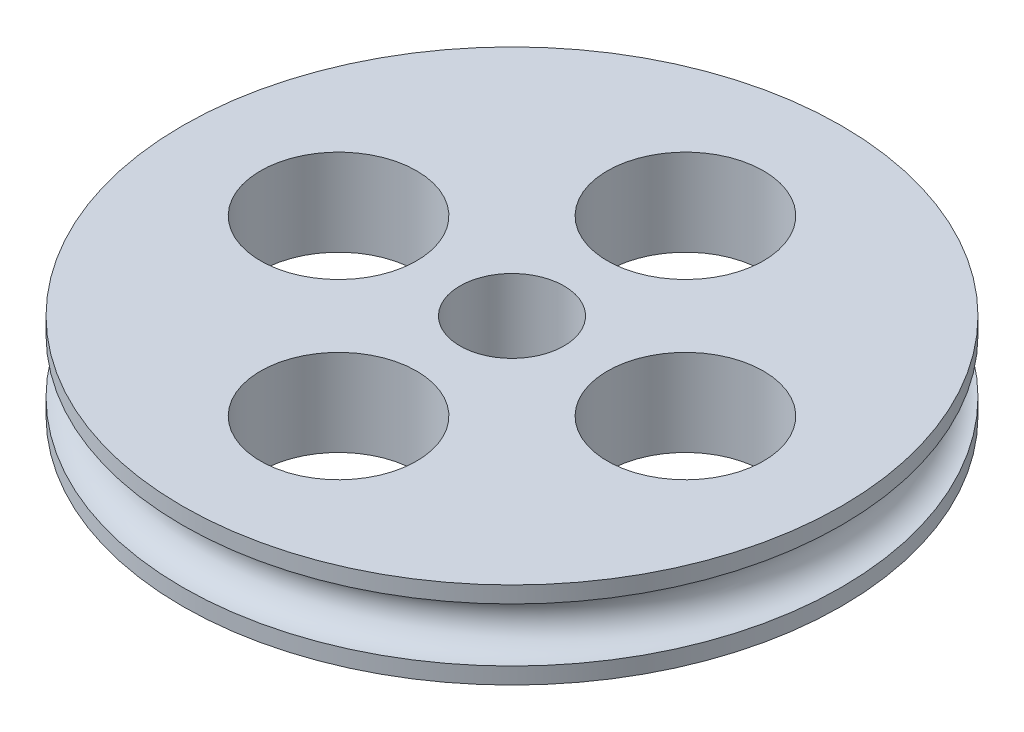
ISO-10303-21;
HEADER;
FILE_DESCRIPTION(('STEP AP214'),'2;1');
FILE_NAME('part.step','',(''),(''),'','','');
FILE_SCHEMA(('AUTOMOTIVE_DESIGN { 1 0 10303 214 1 1 1 1 }'));
ENDSEC;
DATA;
#1=APPLICATION_CONTEXT('core data for automotive mechanical design processes');
#2=APPLICATION_PROTOCOL_DEFINITION('international standard','automotive_design',2000,#1);
#3=PRODUCT_CONTEXT('',#1,'mechanical');
#4=PRODUCT('Part','Part','',(#3));
#5=PRODUCT_RELATED_PRODUCT_CATEGORY('part','',(#4));
#6=PRODUCT_DEFINITION_FORMATION('','',#4);
#7=PRODUCT_DEFINITION_CONTEXT('part definition',#1,'design');
#8=PRODUCT_DEFINITION('design','',#6,#7);
#9=PRODUCT_DEFINITION_SHAPE('','',#8);
#10=(LENGTH_UNIT() NAMED_UNIT(*) SI_UNIT(.MILLI.,.METRE.));
#11=(NAMED_UNIT(*) PLANE_ANGLE_UNIT() SI_UNIT($,.RADIAN.));
#12=(NAMED_UNIT(*) SI_UNIT($,.STERADIAN.) SOLID_ANGLE_UNIT());
#13=UNCERTAINTY_MEASURE_WITH_UNIT(LENGTH_MEASURE(1.E-05),#10,'distance_accuracy_value','');
#14=(GEOMETRIC_REPRESENTATION_CONTEXT(3) GLOBAL_UNCERTAINTY_ASSIGNED_CONTEXT((#13)) GLOBAL_UNIT_ASSIGNED_CONTEXT((#10,
#11,#12)) REPRESENTATION_CONTEXT('',''));
#15=CARTESIAN_POINT('',(0.,0.,0.));
#16=DIRECTION('',(0.,0.,1.));
#17=DIRECTION('',(1.,0.,0.));
#18=AXIS2_PLACEMENT_3D('',#15,#16,#17);
#19=CARTESIAN_POINT('',(0.,2.5,0.));
#20=DIRECTION('',(0.,-1.,0.));
#21=DIRECTION('',(0.,0.,-1.));
#22=AXIS2_PLACEMENT_3D('',#19,#20,#21);
#23=TOROIDAL_SURFACE('',#22,19.,1.55);
#24=CARTESIAN_POINT('',(0.,0.95,0.));
#25=DIRECTION('',(0.,-1.,0.));
#26=DIRECTION('',(0.,0.,-1.));
#27=AXIS2_PLACEMENT_3D('',#24,#25,#26);
#28=CIRCLE('',#27,19.);
#29=CARTESIAN_POINT('',(0.,0.95,-19.));
#30=VERTEX_POINT('',#29);
#31=EDGE_CURVE('E10',#30,#30,#28,.T.);
#32=ORIENTED_EDGE('',*,*,#31,.F.);
#33=EDGE_LOOP('',(#32));
#34=FACE_BOUND('',#33,.T.);
#35=CARTESIAN_POINT('',(0.,4.05,0.));
#36=DIRECTION('',(0.,-1.,0.));
#37=DIRECTION('',(0.,0.,-1.));
#38=AXIS2_PLACEMENT_3D('',#35,#36,#37);
#39=CIRCLE('',#38,19.);
#40=CARTESIAN_POINT('',(0.,4.05,-19.));
#41=VERTEX_POINT('',#40);
#42=EDGE_CURVE('E55',#41,#41,#39,.T.);
#43=ORIENTED_EDGE('',*,*,#42,.T.);
#44=EDGE_LOOP('',(#43));
#45=FACE_BOUND('',#44,.T.);
#46=ADVANCED_FACE('F33',(#34,#45),#23,.F.);
#47=CARTESIAN_POINT('',(0.,0.,0.));
#48=DIRECTION('',(0.,-1.,0.));
#49=DIRECTION('',(0.,0.,-1.));
#50=AXIS2_PLACEMENT_3D('',#47,#48,#49);
#51=CYLINDRICAL_SURFACE('',#50,19.);
#52=CARTESIAN_POINT('',(0.,0.,0.));
#53=DIRECTION('',(0.,-1.,0.));
#54=DIRECTION('',(0.,0.,-1.));
#55=AXIS2_PLACEMENT_3D('',#52,#53,#54);
#56=CIRCLE('',#55,19.);
#57=CARTESIAN_POINT('',(0.,0.,-19.));
#58=VERTEX_POINT('',#57);
#59=EDGE_CURVE('E39',#58,#58,#56,.T.);
#60=ORIENTED_EDGE('',*,*,#59,.F.);
#61=EDGE_LOOP('',(#60));
#62=FACE_BOUND('',#61,.T.);
#63=ORIENTED_EDGE('',*,*,#31,.T.);
#64=EDGE_LOOP('',(#63));
#65=FACE_BOUND('',#64,.T.);
#66=ADVANCED_FACE('F97',(#62,#65),#51,.T.);
#67=CARTESIAN_POINT('',(-19.,0.,0.));
#68=DIRECTION('',(0.,1.,0.));
#69=DIRECTION('',(0.,0.,1.));
#70=AXIS2_PLACEMENT_3D('',#67,#68,#69);
#71=PLANE('',#70);
#72=CARTESIAN_POINT('',(-10.,0.,1.04744440165294E-13));
#73=DIRECTION('',(0.,-1.,0.));
#74=DIRECTION('',(0.,0.,-1.));
#75=AXIS2_PLACEMENT_3D('',#72,#73,#74);
#76=CIRCLE('',#75,4.5);
#77=CARTESIAN_POINT('',(-10.,0.,-4.49999999999989));
#78=VERTEX_POINT('',#77);
#79=EDGE_CURVE('E77',#78,#78,#76,.T.);
#80=ORIENTED_EDGE('',*,*,#79,.F.);
#81=EDGE_LOOP('',(#80));
#82=FACE_BOUND('',#81,.T.);
#83=CARTESIAN_POINT('',(0.,0.,-10.));
#84=DIRECTION('',(0.,-1.,0.));
#85=DIRECTION('',(0.,0.,-1.));
#86=AXIS2_PLACEMENT_3D('',#83,#84,#85);
#87=CIRCLE('',#86,4.5);
#88=CARTESIAN_POINT('',(0.,0.,-14.5));
#89=VERTEX_POINT('',#88);
#90=EDGE_CURVE('E71',#89,#89,#87,.T.);
#91=ORIENTED_EDGE('',*,*,#90,.F.);
#92=EDGE_LOOP('',(#91));
#93=FACE_BOUND('',#92,.T.);
#94=CARTESIAN_POINT('',(10.,0.,0.));
#95=DIRECTION('',(0.,-1.,0.));
#96=DIRECTION('',(0.,0.,-1.));
#97=AXIS2_PLACEMENT_3D('',#94,#95,#96);
#98=CIRCLE('',#97,4.5);
#99=CARTESIAN_POINT('',(10.,0.,-4.50000000000003));
#100=VERTEX_POINT('',#99);
#101=EDGE_CURVE('E65',#100,#100,#98,.T.);
#102=ORIENTED_EDGE('',*,*,#101,.F.);
#103=EDGE_LOOP('',(#102));
#104=FACE_BOUND('',#103,.T.);
#105=CARTESIAN_POINT('',(0.,0.,10.));
#106=DIRECTION('',(0.,-1.,0.));
#107=DIRECTION('',(0.,0.,-1.));
#108=AXIS2_PLACEMENT_3D('',#105,#106,#107);
#109=CIRCLE('',#108,4.5);
#110=CARTESIAN_POINT('',(0.,0.,5.5));
#111=VERTEX_POINT('',#110);
#112=EDGE_CURVE('E59',#111,#111,#109,.T.);
#113=ORIENTED_EDGE('',*,*,#112,.F.);
#114=EDGE_LOOP('',(#113));
#115=FACE_BOUND('',#114,.T.);
#116=CARTESIAN_POINT('',(0.,0.,0.));
#117=DIRECTION('',(0.,-1.,0.));
#118=DIRECTION('',(0.,0.,-1.));
#119=AXIS2_PLACEMENT_3D('',#116,#117,#118);
#120=CIRCLE('',#119,3.);
#121=CARTESIAN_POINT('',(0.,0.,-3.));
#122=VERTEX_POINT('',#121);
#123=EDGE_CURVE('E43',#122,#122,#120,.T.);
#124=ORIENTED_EDGE('',*,*,#123,.F.);
#125=EDGE_LOOP('',(#124));
#126=FACE_BOUND('',#125,.T.);
#127=ORIENTED_EDGE('',*,*,#59,.T.);
#128=EDGE_LOOP('',(#127));
#129=FACE_BOUND('',#128,.T.);
#130=ADVANCED_FACE('F93',(#82,#93,#104,#115,#126,#129),#71,.F.);
#131=CARTESIAN_POINT('',(0.,0.,0.));
#132=DIRECTION('',(0.,-1.,0.));
#133=DIRECTION('',(0.,0.,-1.));
#134=AXIS2_PLACEMENT_3D('',#131,#132,#133);
#135=CYLINDRICAL_SURFACE('',#134,3.);
#136=CARTESIAN_POINT('',(0.,5.,0.));
#137=DIRECTION('',(0.,-1.,0.));
#138=DIRECTION('',(0.,0.,-1.));
#139=AXIS2_PLACEMENT_3D('',#136,#137,#138);
#140=CIRCLE('',#139,3.);
#141=CARTESIAN_POINT('',(0.,5.,-3.));
#142=VERTEX_POINT('',#141);
#143=EDGE_CURVE('E47',#142,#142,#140,.T.);
#144=ORIENTED_EDGE('',*,*,#143,.F.);
#145=EDGE_LOOP('',(#144));
#146=FACE_BOUND('',#145,.T.);
#147=ORIENTED_EDGE('',*,*,#123,.T.);
#148=EDGE_LOOP('',(#147));
#149=FACE_BOUND('',#148,.T.);
#150=ADVANCED_FACE('F96',(#146,#149),#135,.F.);
#151=CARTESIAN_POINT('',(-19.,5.,0.));
#152=DIRECTION('',(0.,-1.,0.));
#153=DIRECTION('',(0.,0.,-1.));
#154=AXIS2_PLACEMENT_3D('',#151,#152,#153);
#155=PLANE('',#154);
#156=CARTESIAN_POINT('',(-10.,5.,1.04744440165294E-13));
#157=DIRECTION('',(0.,-1.,0.));
#158=DIRECTION('',(0.,0.,-1.));
#159=AXIS2_PLACEMENT_3D('',#156,#157,#158);
#160=CIRCLE('',#159,4.5);
#161=CARTESIAN_POINT('',(-10.,5.,-4.49999999999989));
#162=VERTEX_POINT('',#161);
#163=EDGE_CURVE('E74',#162,#162,#160,.T.);
#164=ORIENTED_EDGE('',*,*,#163,.T.);
#165=EDGE_LOOP('',(#164));
#166=FACE_BOUND('',#165,.T.);
#167=CARTESIAN_POINT('',(0.,5.,-10.));
#168=DIRECTION('',(0.,-1.,0.));
#169=DIRECTION('',(0.,0.,-1.));
#170=AXIS2_PLACEMENT_3D('',#167,#168,#169);
#171=CIRCLE('',#170,4.5);
#172=CARTESIAN_POINT('',(0.,5.,-14.5));
#173=VERTEX_POINT('',#172);
#174=EDGE_CURVE('E68',#173,#173,#171,.T.);
#175=ORIENTED_EDGE('',*,*,#174,.T.);
#176=EDGE_LOOP('',(#175));
#177=FACE_BOUND('',#176,.T.);
#178=CARTESIAN_POINT('',(10.,5.,0.));
#179=DIRECTION('',(0.,-1.,0.));
#180=DIRECTION('',(0.,0.,-1.));
#181=AXIS2_PLACEMENT_3D('',#178,#179,#180);
#182=CIRCLE('',#181,4.5);
#183=CARTESIAN_POINT('',(10.,5.,-4.50000000000003));
#184=VERTEX_POINT('',#183);
#185=EDGE_CURVE('E62',#184,#184,#182,.T.);
#186=ORIENTED_EDGE('',*,*,#185,.T.);
#187=EDGE_LOOP('',(#186));
#188=FACE_BOUND('',#187,.T.);
#189=CARTESIAN_POINT('',(0.,5.,10.));
#190=DIRECTION('',(0.,-1.,0.));
#191=DIRECTION('',(0.,0.,-1.));
#192=AXIS2_PLACEMENT_3D('',#189,#190,#191);
#193=CIRCLE('',#192,4.5);
#194=CARTESIAN_POINT('',(0.,5.,5.5));
#195=VERTEX_POINT('',#194);
#196=EDGE_CURVE('E58',#195,#195,#193,.T.);
#197=ORIENTED_EDGE('',*,*,#196,.T.);
#198=EDGE_LOOP('',(#197));
#199=FACE_BOUND('',#198,.T.);
#200=CARTESIAN_POINT('',(0.,5.,0.));
#201=DIRECTION('',(0.,-1.,0.));
#202=DIRECTION('',(0.,0.,-1.));
#203=AXIS2_PLACEMENT_3D('',#200,#201,#202);
#204=CIRCLE('',#203,19.);
#205=CARTESIAN_POINT('',(0.,5.,-19.));
#206=VERTEX_POINT('',#205);
#207=EDGE_CURVE('E52',#206,#206,#204,.T.);
#208=ORIENTED_EDGE('',*,*,#207,.F.);
#209=EDGE_LOOP('',(#208));
#210=FACE_BOUND('',#209,.T.);
#211=ORIENTED_EDGE('',*,*,#143,.T.);
#212=EDGE_LOOP('',(#211));
#213=FACE_BOUND('',#212,.T.);
#214=ADVANCED_FACE('F83',(#166,#177,#188,#199,#210,#213),#155,.F.);
#215=CARTESIAN_POINT('',(0.,0.,0.));
#216=DIRECTION('',(0.,-1.,0.));
#217=DIRECTION('',(0.,0.,-1.));
#218=AXIS2_PLACEMENT_3D('',#215,#216,#217);
#219=CYLINDRICAL_SURFACE('',#218,19.);
#220=ORIENTED_EDGE('',*,*,#42,.F.);
#221=EDGE_LOOP('',(#220));
#222=FACE_BOUND('',#221,.T.);
#223=ORIENTED_EDGE('',*,*,#207,.T.);
#224=EDGE_LOOP('',(#223));
#225=FACE_BOUND('',#224,.T.);
#226=ADVANCED_FACE('F115',(#222,#225),#219,.T.);
#227=CARTESIAN_POINT('',(0.,5.,10.));
#228=DIRECTION('',(0.,-1.,0.));
#229=DIRECTION('',(0.,0.,-1.));
#230=AXIS2_PLACEMENT_3D('',#227,#228,#229);
#231=CYLINDRICAL_SURFACE('',#230,4.5);
#232=ORIENTED_EDGE('',*,*,#196,.F.);
#233=EDGE_LOOP('',(#232));
#234=FACE_BOUND('',#233,.T.);
#235=ORIENTED_EDGE('',*,*,#112,.T.);
#236=EDGE_LOOP('',(#235));
#237=FACE_BOUND('',#236,.T.);
#238=ADVANCED_FACE('F129',(#234,#237),#231,.F.);
#239=CARTESIAN_POINT('',(10.,5.,0.));
#240=DIRECTION('',(0.,-1.,0.));
#241=DIRECTION('',(0.,0.,-1.));
#242=AXIS2_PLACEMENT_3D('',#239,#240,#241);
#243=CYLINDRICAL_SURFACE('',#242,4.5);
#244=ORIENTED_EDGE('',*,*,#185,.F.);
#245=EDGE_LOOP('',(#244));
#246=FACE_BOUND('',#245,.T.);
#247=ORIENTED_EDGE('',*,*,#101,.T.);
#248=EDGE_LOOP('',(#247));
#249=FACE_BOUND('',#248,.T.);
#250=ADVANCED_FACE('F137',(#246,#249),#243,.F.);
#251=CARTESIAN_POINT('',(0.,5.,-10.));
#252=DIRECTION('',(0.,-1.,0.));
#253=DIRECTION('',(0.,0.,-1.));
#254=AXIS2_PLACEMENT_3D('',#251,#252,#253);
#255=CYLINDRICAL_SURFACE('',#254,4.5);
#256=ORIENTED_EDGE('',*,*,#174,.F.);
#257=EDGE_LOOP('',(#256));
#258=FACE_BOUND('',#257,.T.);
#259=ORIENTED_EDGE('',*,*,#90,.T.);
#260=EDGE_LOOP('',(#259));
#261=FACE_BOUND('',#260,.T.);
#262=ADVANCED_FACE('F89',(#258,#261),#255,.F.);
#263=CARTESIAN_POINT('',(-10.,5.,1.04744440165294E-13));
#264=DIRECTION('',(0.,-1.,0.));
#265=DIRECTION('',(0.,0.,-1.));
#266=AXIS2_PLACEMENT_3D('',#263,#264,#265);
#267=CYLINDRICAL_SURFACE('',#266,4.5);
#268=ORIENTED_EDGE('',*,*,#163,.F.);
#269=EDGE_LOOP('',(#268));
#270=FACE_BOUND('',#269,.T.);
#271=ORIENTED_EDGE('',*,*,#79,.T.);
#272=EDGE_LOOP('',(#271));
#273=FACE_BOUND('',#272,.T.);
#274=ADVANCED_FACE('F86',(#270,#273),#267,.F.);
#275=CLOSED_SHELL('',(#46,#66,#130,#150,#214,#226,#238,#250,#262,#274));
#276=MANIFOLD_SOLID_BREP('B2',#275);
#277=ADVANCED_BREP_SHAPE_REPRESENTATION('',(#18,#276),#14);
#278=SHAPE_DEFINITION_REPRESENTATION(#9,#277);
ENDSEC;
END-ISO-10303-21;
